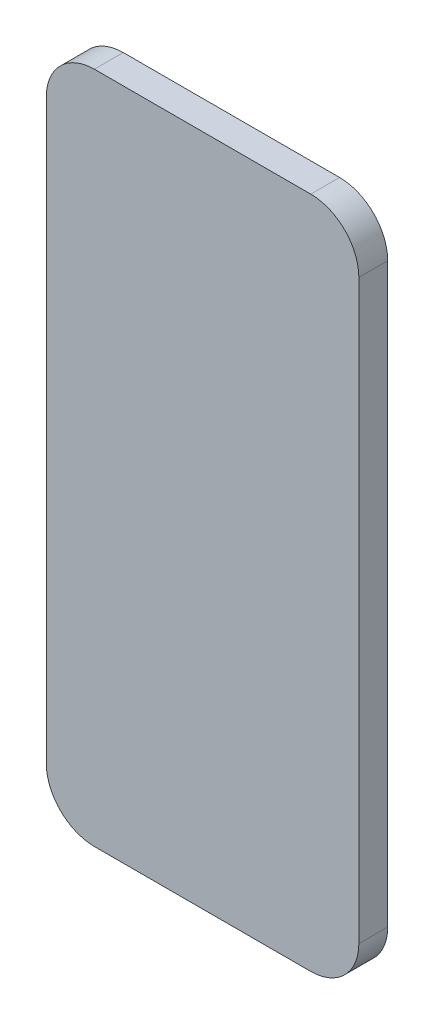
ISO-10303-21;
HEADER;
FILE_DESCRIPTION(('STEP AP214'),'2;1');
FILE_NAME('part.step','',(''),(''),'','','');
FILE_SCHEMA(('AUTOMOTIVE_DESIGN { 1 0 10303 214 1 1 1 1 }'));
ENDSEC;
DATA;
#1=APPLICATION_CONTEXT('core data for automotive mechanical design processes');
#2=APPLICATION_PROTOCOL_DEFINITION('international standard','automotive_design',2000,#1);
#3=PRODUCT_CONTEXT('',#1,'mechanical');
#4=PRODUCT('Part','Part','',(#3));
#5=PRODUCT_RELATED_PRODUCT_CATEGORY('part','',(#4));
#6=PRODUCT_DEFINITION_FORMATION('','',#4);
#7=PRODUCT_DEFINITION_CONTEXT('part definition',#1,'design');
#8=PRODUCT_DEFINITION('design','',#6,#7);
#9=PRODUCT_DEFINITION_SHAPE('','',#8);
#10=(LENGTH_UNIT() NAMED_UNIT(*) SI_UNIT(.MILLI.,.METRE.));
#11=(NAMED_UNIT(*) PLANE_ANGLE_UNIT() SI_UNIT($,.RADIAN.));
#12=(NAMED_UNIT(*) SI_UNIT($,.STERADIAN.) SOLID_ANGLE_UNIT());
#13=UNCERTAINTY_MEASURE_WITH_UNIT(LENGTH_MEASURE(1.E-05),#10,'distance_accuracy_value','');
#14=(GEOMETRIC_REPRESENTATION_CONTEXT(3) GLOBAL_UNCERTAINTY_ASSIGNED_CONTEXT((#13)) GLOBAL_UNIT_ASSIGNED_CONTEXT((#10,
#11,#12)) REPRESENTATION_CONTEXT('',''));
#15=CARTESIAN_POINT('',(0.,0.,0.));
#16=DIRECTION('',(0.,0.,1.));
#17=DIRECTION('',(1.,0.,0.));
#18=AXIS2_PLACEMENT_3D('',#15,#16,#17);
#19=CARTESIAN_POINT('',(-24.375,52.1389846093061,-3.69945784530285));
#20=DIRECTION('',(1.,0.,0.));
#21=DIRECTION('',(0.,1.,0.));
#22=AXIS2_PLACEMENT_3D('',#19,#20,#21);
#23=PLANE('',#22);
#24=DIRECTION('',(0.,-1.,0.));
#25=VECTOR('',#24,1.);
#26=CARTESIAN_POINT('',(-24.375,52.1389846093061,0.80054215469715));
#27=LINE('',#26,#25);
#28=CARTESIAN_POINT('',(-24.375,44.6389846093061,0.80054215469715));
#29=VERTEX_POINT('',#28);
#30=CARTESIAN_POINT('',(-24.375,-45.361015390694,0.80054215469715));
#31=VERTEX_POINT('',#30);
#32=EDGE_CURVE('E113',#29,#31,#27,.T.);
#33=ORIENTED_EDGE('',*,*,#32,.F.);
#34=DIRECTION('',(0.,0.,1.));
#35=VECTOR('',#34,1.);
#36=CARTESIAN_POINT('',(-24.375,44.6389846093061,-3.69945784530285));
#37=LINE('',#36,#35);
#38=CARTESIAN_POINT('',(-24.375,44.6389846093061,-3.69945784530285));
#39=VERTEX_POINT('',#38);
#40=EDGE_CURVE('E117',#39,#29,#37,.T.);
#41=ORIENTED_EDGE('',*,*,#40,.F.);
#42=DIRECTION('',(0.,-1.,0.));
#43=VECTOR('',#42,1.);
#44=CARTESIAN_POINT('',(-24.375,52.1389846093061,-3.69945784530285));
#45=LINE('',#44,#43);
#46=CARTESIAN_POINT('',(-24.375,-45.361015390694,-3.69945784530285));
#47=VERTEX_POINT('',#46);
#48=EDGE_CURVE('E143',#39,#47,#45,.T.);
#49=ORIENTED_EDGE('',*,*,#48,.T.);
#50=DIRECTION('',(0.,0.,1.));
#51=VECTOR('',#50,1.);
#52=CARTESIAN_POINT('',(-24.375,-45.361015390694,-3.69945784530285));
#53=LINE('',#52,#51);
#54=EDGE_CURVE('E152',#31,#47,#53,.F.);
#55=ORIENTED_EDGE('',*,*,#54,.F.);
#56=EDGE_LOOP('',(#33,#41,#49,#55));
#57=FACE_BOUND('',#56,.T.);
#58=ADVANCED_FACE('F39',(#57),#23,.F.);
#59=CARTESIAN_POINT('',(24.375,-52.861015390694,-3.69945784530285));
#60=DIRECTION('',(0.,1.,0.));
#61=DIRECTION('',(-1.,0.,0.));
#62=AXIS2_PLACEMENT_3D('',#59,#60,#61);
#63=PLANE('',#62);
#64=DIRECTION('',(1.,0.,0.));
#65=VECTOR('',#64,1.);
#66=CARTESIAN_POINT('',(24.375,-52.861015390694,-3.69945784530285));
#67=LINE('',#66,#65);
#68=CARTESIAN_POINT('',(-16.875,-52.861015390694,-3.69945784530285));
#69=VERTEX_POINT('',#68);
#70=CARTESIAN_POINT('',(16.875,-52.861015390694,-3.69945784530285));
#71=VERTEX_POINT('',#70);
#72=EDGE_CURVE('E179',#69,#71,#67,.T.);
#73=ORIENTED_EDGE('',*,*,#72,.T.);
#74=DIRECTION('',(0.,0.,1.));
#75=VECTOR('',#74,1.);
#76=CARTESIAN_POINT('',(16.875,-52.861015390694,-3.69945784530285));
#77=LINE('',#76,#75);
#78=CARTESIAN_POINT('',(16.875,-52.861015390694,0.80054215469715));
#79=VERTEX_POINT('',#78);
#80=EDGE_CURVE('E128',#79,#71,#77,.F.);
#81=ORIENTED_EDGE('',*,*,#80,.F.);
#82=DIRECTION('',(1.,0.,0.));
#83=VECTOR('',#82,1.);
#84=CARTESIAN_POINT('',(24.375,-52.861015390694,0.80054215469715));
#85=LINE('',#84,#83);
#86=CARTESIAN_POINT('',(-16.875,-52.861015390694,0.80054215469715));
#87=VERTEX_POINT('',#86);
#88=EDGE_CURVE('E110',#87,#79,#85,.T.);
#89=ORIENTED_EDGE('',*,*,#88,.F.);
#90=DIRECTION('',(0.,0.,1.));
#91=VECTOR('',#90,1.);
#92=CARTESIAN_POINT('',(-16.875,-52.861015390694,-3.69945784530285));
#93=LINE('',#92,#91);
#94=EDGE_CURVE('E121',#69,#87,#93,.T.);
#95=ORIENTED_EDGE('',*,*,#94,.F.);
#96=EDGE_LOOP('',(#73,#81,#89,#95));
#97=FACE_BOUND('',#96,.T.);
#98=ADVANCED_FACE('F130',(#97),#63,.F.);
#99=CARTESIAN_POINT('',(24.375,52.1389846093061,-3.69945784530285));
#100=DIRECTION('',(-1.,0.,0.));
#101=DIRECTION('',(0.,-1.,0.));
#102=AXIS2_PLACEMENT_3D('',#99,#100,#101);
#103=PLANE('',#102);
#104=DIRECTION('',(0.,1.,0.));
#105=VECTOR('',#104,1.);
#106=CARTESIAN_POINT('',(24.375,52.1389846093061,-3.69945784530285));
#107=LINE('',#106,#105);
#108=CARTESIAN_POINT('',(24.375,-45.3610153906939,-3.69945784530285));
#109=VERTEX_POINT('',#108);
#110=CARTESIAN_POINT('',(24.375,44.6389846093061,-3.69945784530285));
#111=VERTEX_POINT('',#110);
#112=EDGE_CURVE('E178',#109,#111,#107,.T.);
#113=ORIENTED_EDGE('',*,*,#112,.T.);
#114=DIRECTION('',(0.,0.,1.));
#115=VECTOR('',#114,1.);
#116=CARTESIAN_POINT('',(24.375,44.6389846093061,-3.69945784530285));
#117=LINE('',#116,#115);
#118=CARTESIAN_POINT('',(24.375,44.6389846093061,0.80054215469715));
#119=VERTEX_POINT('',#118);
#120=EDGE_CURVE('E159',#119,#111,#117,.F.);
#121=ORIENTED_EDGE('',*,*,#120,.F.);
#122=DIRECTION('',(0.,1.,0.));
#123=VECTOR('',#122,1.);
#124=CARTESIAN_POINT('',(24.375,52.1389846093061,0.80054215469715));
#125=LINE('',#124,#123);
#126=CARTESIAN_POINT('',(24.375,-45.3610153906939,0.80054215469715));
#127=VERTEX_POINT('',#126);
#128=EDGE_CURVE('E132',#127,#119,#125,.T.);
#129=ORIENTED_EDGE('',*,*,#128,.F.);
#130=DIRECTION('',(0.,0.,1.));
#131=VECTOR('',#130,1.);
#132=CARTESIAN_POINT('',(24.375,-45.3610153906939,-3.69945784530285));
#133=LINE('',#132,#131);
#134=EDGE_CURVE('E161',#109,#127,#133,.T.);
#135=ORIENTED_EDGE('',*,*,#134,.F.);
#136=EDGE_LOOP('',(#113,#121,#129,#135));
#137=FACE_BOUND('',#136,.T.);
#138=ADVANCED_FACE('F176',(#137),#103,.F.);
#139=CARTESIAN_POINT('',(24.375,52.1389846093061,-3.69945784530285));
#140=DIRECTION('',(0.,-1.,0.));
#141=DIRECTION('',(1.,0.,0.));
#142=AXIS2_PLACEMENT_3D('',#139,#140,#141);
#143=PLANE('',#142);
#144=DIRECTION('',(-1.,0.,0.));
#145=VECTOR('',#144,1.);
#146=CARTESIAN_POINT('',(24.375,52.1389846093061,-3.69945784530285));
#147=LINE('',#146,#145);
#148=CARTESIAN_POINT('',(16.875,52.1389846093061,-3.69945784530285));
#149=VERTEX_POINT('',#148);
#150=CARTESIAN_POINT('',(-16.875,52.1389846093061,-3.69945784530285));
#151=VERTEX_POINT('',#150);
#152=EDGE_CURVE('E144',#149,#151,#147,.T.);
#153=ORIENTED_EDGE('',*,*,#152,.T.);
#154=DIRECTION('',(0.,0.,1.));
#155=VECTOR('',#154,1.);
#156=CARTESIAN_POINT('',(-16.875,52.1389846093061,-3.69945784530285));
#157=LINE('',#156,#155);
#158=CARTESIAN_POINT('',(-16.875,52.1389846093061,0.80054215469715));
#159=VERTEX_POINT('',#158);
#160=EDGE_CURVE('E164',#159,#151,#157,.F.);
#161=ORIENTED_EDGE('',*,*,#160,.F.);
#162=DIRECTION('',(-1.,0.,0.));
#163=VECTOR('',#162,1.);
#164=CARTESIAN_POINT('',(24.375,52.1389846093061,0.80054215469715));
#165=LINE('',#164,#163);
#166=CARTESIAN_POINT('',(16.875,52.1389846093061,0.80054215469715));
#167=VERTEX_POINT('',#166);
#168=EDGE_CURVE('E135',#167,#159,#165,.T.);
#169=ORIENTED_EDGE('',*,*,#168,.F.);
#170=DIRECTION('',(0.,0.,1.));
#171=VECTOR('',#170,1.);
#172=CARTESIAN_POINT('',(16.875,52.1389846093061,-3.69945784530285));
#173=LINE('',#172,#171);
#174=EDGE_CURVE('E47',#149,#167,#173,.T.);
#175=ORIENTED_EDGE('',*,*,#174,.F.);
#176=EDGE_LOOP('',(#153,#161,#169,#175));
#177=FACE_BOUND('',#176,.T.);
#178=ADVANCED_FACE('F170',(#177),#143,.F.);
#179=CARTESIAN_POINT('',(0.,-0.361015390693925,-3.69945784530285));
#180=DIRECTION('',(0.,0.,1.));
#181=DIRECTION('',(-1.,0.,0.));
#182=AXIS2_PLACEMENT_3D('',#179,#180,#181);
#183=PLANE('',#182);
#184=CARTESIAN_POINT('',(0.,37.1389846093061,-3.69945784530285));
#185=DIRECTION('',(0.,0.,-1.));
#186=DIRECTION('',(-1.,0.,0.));
#187=AXIS2_PLACEMENT_3D('',#184,#185,#186);
#188=CIRCLE('',#187,6.);
#189=CARTESIAN_POINT('',(-6.,37.1389846093061,-3.69945784530285));
#190=VERTEX_POINT('',#189);
#191=EDGE_CURVE('E11',#190,#190,#188,.F.);
#192=ORIENTED_EDGE('',*,*,#191,.T.);
#193=EDGE_LOOP('',(#192));
#194=FACE_BOUND('',#193,.T.);
#195=ORIENTED_EDGE('',*,*,#48,.F.);
#196=CARTESIAN_POINT('',(-16.875,44.6389846093061,-3.69945784530285));
#197=DIRECTION('',(0.,0.,-1.));
#198=DIRECTION('',(-1.,0.,0.));
#199=AXIS2_PLACEMENT_3D('',#196,#197,#198);
#200=CIRCLE('',#199,7.5);
#201=EDGE_CURVE('E54',#151,#39,#200,.F.);
#202=ORIENTED_EDGE('',*,*,#201,.F.);
#203=ORIENTED_EDGE('',*,*,#152,.F.);
#204=CARTESIAN_POINT('',(16.875,44.6389846093061,-3.69945784530285));
#205=DIRECTION('',(0.,0.,-1.));
#206=DIRECTION('',(-1.,0.,0.));
#207=AXIS2_PLACEMENT_3D('',#204,#205,#206);
#208=CIRCLE('',#207,7.5);
#209=EDGE_CURVE('E62',#111,#149,#208,.F.);
#210=ORIENTED_EDGE('',*,*,#209,.F.);
#211=ORIENTED_EDGE('',*,*,#112,.F.);
#212=CARTESIAN_POINT('',(16.875,-45.3610153906939,-3.69945784530285));
#213=DIRECTION('',(0.,0.,-1.));
#214=DIRECTION('',(-1.,0.,0.));
#215=AXIS2_PLACEMENT_3D('',#212,#213,#214);
#216=CIRCLE('',#215,7.5);
#217=EDGE_CURVE('E156',#71,#109,#216,.F.);
#218=ORIENTED_EDGE('',*,*,#217,.F.);
#219=ORIENTED_EDGE('',*,*,#72,.F.);
#220=CARTESIAN_POINT('',(-16.875,-45.361015390694,-3.69945784530285));
#221=DIRECTION('',(0.,0.,-1.));
#222=DIRECTION('',(-1.,0.,0.));
#223=AXIS2_PLACEMENT_3D('',#220,#221,#222);
#224=CIRCLE('',#223,7.5);
#225=EDGE_CURVE('E123',#47,#69,#224,.F.);
#226=ORIENTED_EDGE('',*,*,#225,.F.);
#227=EDGE_LOOP('',(#195,#202,#203,#210,#211,#218,#219,#226));
#228=FACE_BOUND('',#227,.T.);
#229=ADVANCED_FACE('F220',(#194,#228),#183,.F.);
#230=CARTESIAN_POINT('',(0.,-0.361015390693925,0.80054215469715));
#231=DIRECTION('',(0.,0.,1.));
#232=DIRECTION('',(-1.,0.,0.));
#233=AXIS2_PLACEMENT_3D('',#230,#231,#232);
#234=PLANE('',#233);
#235=ORIENTED_EDGE('',*,*,#88,.T.);
#236=CARTESIAN_POINT('',(16.875,-45.3610153906939,0.80054215469715));
#237=DIRECTION('',(0.,0.,-1.));
#238=DIRECTION('',(-1.,0.,0.));
#239=AXIS2_PLACEMENT_3D('',#236,#237,#238);
#240=CIRCLE('',#239,7.5);
#241=EDGE_CURVE('E118',#127,#79,#240,.T.);
#242=ORIENTED_EDGE('',*,*,#241,.F.);
#243=ORIENTED_EDGE('',*,*,#128,.T.);
#244=CARTESIAN_POINT('',(16.875,44.6389846093061,0.80054215469715));
#245=DIRECTION('',(0.,0.,-1.));
#246=DIRECTION('',(-1.,0.,0.));
#247=AXIS2_PLACEMENT_3D('',#244,#245,#246);
#248=CIRCLE('',#247,7.5);
#249=EDGE_CURVE('E147',#167,#119,#248,.T.);
#250=ORIENTED_EDGE('',*,*,#249,.F.);
#251=ORIENTED_EDGE('',*,*,#168,.T.);
#252=CARTESIAN_POINT('',(-16.875,44.6389846093061,0.80054215469715));
#253=DIRECTION('',(0.,0.,-1.));
#254=DIRECTION('',(-1.,0.,0.));
#255=AXIS2_PLACEMENT_3D('',#252,#253,#254);
#256=CIRCLE('',#255,7.5);
#257=EDGE_CURVE('E127',#29,#159,#256,.T.);
#258=ORIENTED_EDGE('',*,*,#257,.F.);
#259=ORIENTED_EDGE('',*,*,#32,.T.);
#260=CARTESIAN_POINT('',(-16.875,-45.361015390694,0.80054215469715));
#261=DIRECTION('',(0.,0.,-1.));
#262=DIRECTION('',(-1.,0.,0.));
#263=AXIS2_PLACEMENT_3D('',#260,#261,#262);
#264=CIRCLE('',#263,7.5);
#265=EDGE_CURVE('E106',#87,#31,#264,.T.);
#266=ORIENTED_EDGE('',*,*,#265,.F.);
#267=EDGE_LOOP('',(#235,#242,#243,#250,#251,#258,#259,#266));
#268=FACE_BOUND('',#267,.T.);
#269=ADVANCED_FACE('F108',(#268),#234,.T.);
#270=CARTESIAN_POINT('',(-16.875,-45.361015390694,-3.69945784530285));
#271=DIRECTION('',(0.,0.,1.));
#272=DIRECTION('',(-1.,0.,0.));
#273=AXIS2_PLACEMENT_3D('',#270,#271,#272);
#274=CYLINDRICAL_SURFACE('',#273,7.5);
#275=ORIENTED_EDGE('',*,*,#225,.T.);
#276=ORIENTED_EDGE('',*,*,#94,.T.);
#277=ORIENTED_EDGE('',*,*,#265,.T.);
#278=ORIENTED_EDGE('',*,*,#54,.T.);
#279=EDGE_LOOP('',(#275,#276,#277,#278));
#280=FACE_BOUND('',#279,.T.);
#281=ADVANCED_FACE('F122',(#280),#274,.T.);
#282=CARTESIAN_POINT('',(16.875,-45.3610153906939,-3.69945784530285));
#283=DIRECTION('',(0.,0.,1.));
#284=DIRECTION('',(-1.,0.,0.));
#285=AXIS2_PLACEMENT_3D('',#282,#283,#284);
#286=CYLINDRICAL_SURFACE('',#285,7.5);
#287=ORIENTED_EDGE('',*,*,#217,.T.);
#288=ORIENTED_EDGE('',*,*,#134,.T.);
#289=ORIENTED_EDGE('',*,*,#241,.T.);
#290=ORIENTED_EDGE('',*,*,#80,.T.);
#291=EDGE_LOOP('',(#287,#288,#289,#290));
#292=FACE_BOUND('',#291,.T.);
#293=ADVANCED_FACE('F209',(#292),#286,.T.);
#294=CARTESIAN_POINT('',(16.875,44.6389846093061,-3.69945784530285));
#295=DIRECTION('',(0.,0.,1.));
#296=DIRECTION('',(-1.,0.,0.));
#297=AXIS2_PLACEMENT_3D('',#294,#295,#296);
#298=CYLINDRICAL_SURFACE('',#297,7.5);
#299=ORIENTED_EDGE('',*,*,#209,.T.);
#300=ORIENTED_EDGE('',*,*,#174,.T.);
#301=ORIENTED_EDGE('',*,*,#249,.T.);
#302=ORIENTED_EDGE('',*,*,#120,.T.);
#303=EDGE_LOOP('',(#299,#300,#301,#302));
#304=FACE_BOUND('',#303,.T.);
#305=ADVANCED_FACE('F166',(#304),#298,.T.);
#306=CARTESIAN_POINT('',(-16.875,44.6389846093061,-3.69945784530285));
#307=DIRECTION('',(0.,0.,1.));
#308=DIRECTION('',(-1.,0.,0.));
#309=AXIS2_PLACEMENT_3D('',#306,#307,#308);
#310=CYLINDRICAL_SURFACE('',#309,7.5);
#311=ORIENTED_EDGE('',*,*,#201,.T.);
#312=ORIENTED_EDGE('',*,*,#40,.T.);
#313=ORIENTED_EDGE('',*,*,#257,.T.);
#314=ORIENTED_EDGE('',*,*,#160,.T.);
#315=EDGE_LOOP('',(#311,#312,#313,#314));
#316=FACE_BOUND('',#315,.T.);
#317=ADVANCED_FACE('F41',(#316),#310,.T.);
#318=CARTESIAN_POINT('',(0.,37.1389846093061,-9.69945784530285));
#319=DIRECTION('',(0.,0.,1.));
#320=DIRECTION('',(-1.,0.,0.));
#321=AXIS2_PLACEMENT_3D('',#318,#319,#320);
#322=CYLINDRICAL_SURFACE('',#321,6.);
#323=CARTESIAN_POINT('',(0.,37.1389846093061,-9.69945784530285));
#324=DIRECTION('',(0.,0.,1.));
#325=DIRECTION('',(1.,0.,0.));
#326=AXIS2_PLACEMENT_3D('',#323,#324,#325);
#327=CIRCLE('',#326,6.);
#328=CARTESIAN_POINT('',(6.,37.1389846093061,-9.69945784530285));
#329=VERTEX_POINT('',#328);
#330=EDGE_CURVE('E137',#329,#329,#327,.T.);
#331=ORIENTED_EDGE('',*,*,#330,.T.);
#332=EDGE_LOOP('',(#331));
#333=FACE_BOUND('',#332,.T.);
#334=ORIENTED_EDGE('',*,*,#191,.F.);
#335=EDGE_LOOP('',(#334));
#336=FACE_BOUND('',#335,.T.);
#337=ADVANCED_FACE('F188',(#333,#336),#322,.T.);
#338=CARTESIAN_POINT('',(0.,37.1389846093061,-9.69945784530285));
#339=DIRECTION('',(0.,0.,-1.));
#340=DIRECTION('',(1.,0.,0.));
#341=AXIS2_PLACEMENT_3D('',#338,#339,#340);
#342=PLANE('',#341);
#343=ORIENTED_EDGE('',*,*,#330,.F.);
#344=EDGE_LOOP('',(#343));
#345=FACE_BOUND('',#344,.T.);
#346=ADVANCED_FACE('F191',(#345),#342,.T.);
#347=CLOSED_SHELL('',(#58,#98,#138,#178,#229,#269,#281,#293,#305,#317,#337,#346));
#348=MANIFOLD_SOLID_BREP('B2',#347);
#349=ADVANCED_BREP_SHAPE_REPRESENTATION('',(#18,#348),#14);
#350=SHAPE_DEFINITION_REPRESENTATION(#9,#349);
ENDSEC;
END-ISO-10303-21;
